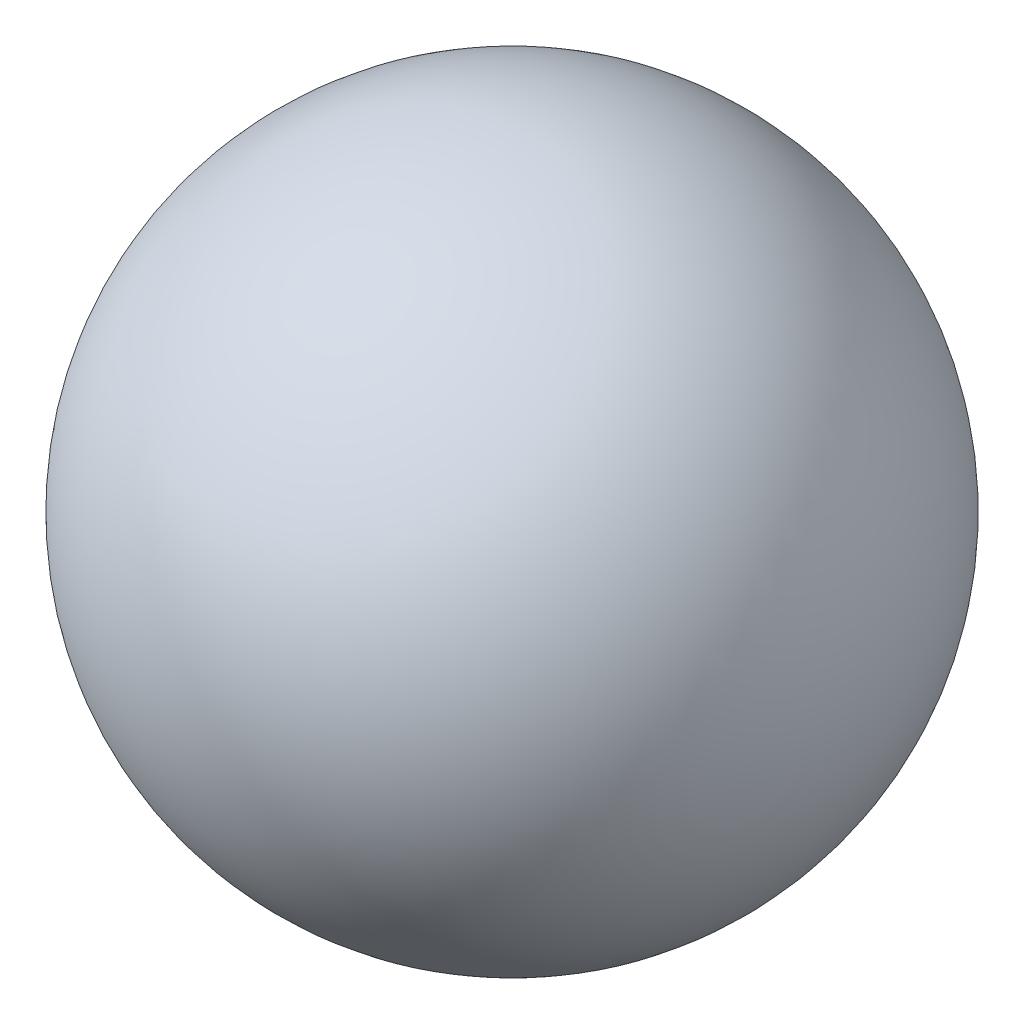
ISO-10303-21;
HEADER;
FILE_DESCRIPTION(('STEP AP214'),'2;1');
FILE_NAME('part.step','',(''),(''),'','','');
FILE_SCHEMA(('AUTOMOTIVE_DESIGN { 1 0 10303 214 1 1 1 1 }'));
ENDSEC;
DATA;
#1=APPLICATION_CONTEXT('core data for automotive mechanical design processes');
#2=APPLICATION_PROTOCOL_DEFINITION('international standard','automotive_design',2000,#1);
#3=PRODUCT_CONTEXT('',#1,'mechanical');
#4=PRODUCT('Part','Part','',(#3));
#5=PRODUCT_RELATED_PRODUCT_CATEGORY('part','',(#4));
#6=PRODUCT_DEFINITION_FORMATION('','',#4);
#7=PRODUCT_DEFINITION_CONTEXT('part definition',#1,'design');
#8=PRODUCT_DEFINITION('design','',#6,#7);
#9=PRODUCT_DEFINITION_SHAPE('','',#8);
#10=(LENGTH_UNIT() NAMED_UNIT(*) SI_UNIT(.MILLI.,.METRE.));
#11=(NAMED_UNIT(*) PLANE_ANGLE_UNIT() SI_UNIT($,.RADIAN.));
#12=(NAMED_UNIT(*) SI_UNIT($,.STERADIAN.) SOLID_ANGLE_UNIT());
#13=UNCERTAINTY_MEASURE_WITH_UNIT(LENGTH_MEASURE(1.E-05),#10,'distance_accuracy_value','');
#14=(GEOMETRIC_REPRESENTATION_CONTEXT(3) GLOBAL_UNCERTAINTY_ASSIGNED_CONTEXT((#13)) GLOBAL_UNIT_ASSIGNED_CONTEXT((#10,
#11,#12)) REPRESENTATION_CONTEXT('',''));
#15=CARTESIAN_POINT('',(0.,0.,0.));
#16=DIRECTION('',(0.,0.,1.));
#17=DIRECTION('',(1.,0.,0.));
#18=AXIS2_PLACEMENT_3D('',#15,#16,#17);
#19=CARTESIAN_POINT('',(0.,0.,0.));
#20=DIRECTION('',(0.,1.,0.));
#21=DIRECTION('',(1.,0.,0.));
#22=AXIS2_PLACEMENT_3D('',#19,#20,#21);
#23=SPHERICAL_SURFACE('',#22,95.);
#24=CARTESIAN_POINT('',(0.,95.,0.));
#25=VERTEX_POINT('',#24);
#26=VERTEX_LOOP('',#25);
#27=FACE_BOUND('',#26,.T.);
#28=ADVANCED_FACE('F45',(#27),#23,.T.);
#29=CLOSED_SHELL('',(#28));
#30=MANIFOLD_SOLID_BREP('B2',#29);
#31=ADVANCED_BREP_SHAPE_REPRESENTATION('',(#18,#30),#14);
#32=SHAPE_DEFINITION_REPRESENTATION(#9,#31);
ENDSEC;
END-ISO-10303-21;
